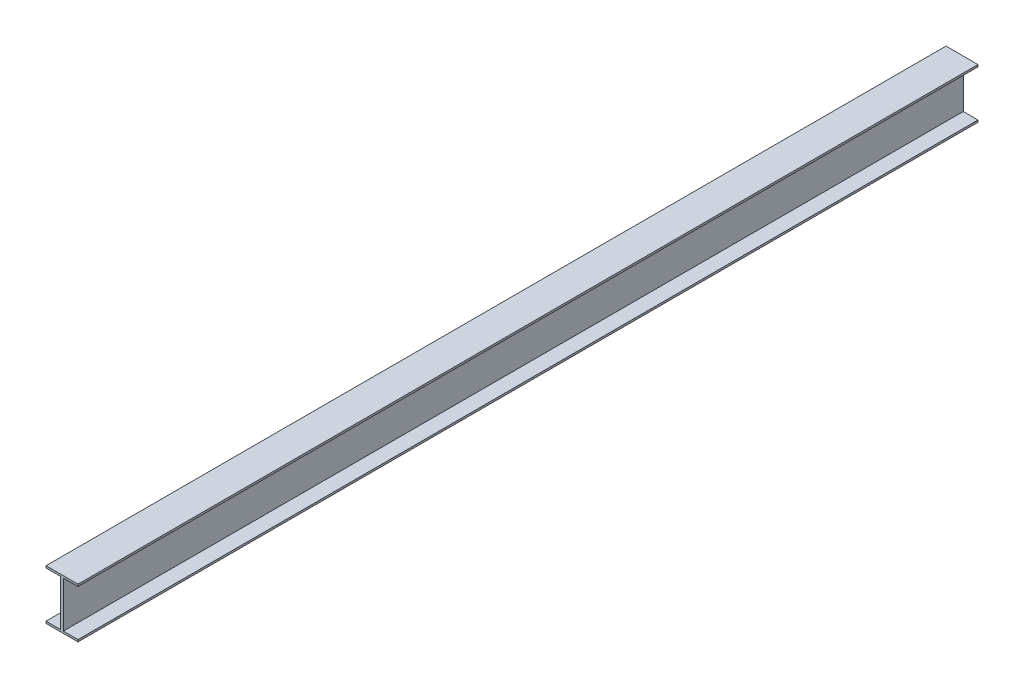
ISO-10303-21;
HEADER;
FILE_DESCRIPTION(('STEP AP214'),'2;1');
FILE_NAME('part.step','',(''),(''),'','','');
FILE_SCHEMA(('AUTOMOTIVE_DESIGN { 1 0 10303 214 1 1 1 1 }'));
ENDSEC;
DATA;
#1=APPLICATION_CONTEXT('core data for automotive mechanical design processes');
#2=APPLICATION_PROTOCOL_DEFINITION('international standard','automotive_design',2000,#1);
#3=PRODUCT_CONTEXT('',#1,'mechanical');
#4=PRODUCT('Part','Part','',(#3));
#5=PRODUCT_RELATED_PRODUCT_CATEGORY('part','',(#4));
#6=PRODUCT_DEFINITION_FORMATION('','',#4);
#7=PRODUCT_DEFINITION_CONTEXT('part definition',#1,'design');
#8=PRODUCT_DEFINITION('design','',#6,#7);
#9=PRODUCT_DEFINITION_SHAPE('','',#8);
#10=(LENGTH_UNIT() NAMED_UNIT(*) SI_UNIT(.MILLI.,.METRE.));
#11=(NAMED_UNIT(*) PLANE_ANGLE_UNIT() SI_UNIT($,.RADIAN.));
#12=(NAMED_UNIT(*) SI_UNIT($,.STERADIAN.) SOLID_ANGLE_UNIT());
#13=UNCERTAINTY_MEASURE_WITH_UNIT(LENGTH_MEASURE(1.E-05),#10,'distance_accuracy_value','');
#14=(GEOMETRIC_REPRESENTATION_CONTEXT(3) GLOBAL_UNCERTAINTY_ASSIGNED_CONTEXT((#13)) GLOBAL_UNIT_ASSIGNED_CONTEXT((#10,
#11,#12)) REPRESENTATION_CONTEXT('',''));
#15=CARTESIAN_POINT('',(0.,0.,0.));
#16=DIRECTION('',(0.,0.,1.));
#17=DIRECTION('',(1.,0.,0.));
#18=AXIS2_PLACEMENT_3D('',#15,#16,#17);
#19=CARTESIAN_POINT('',(0.,0.,4500.));
#20=DIRECTION('',(1.,0.,0.));
#21=DIRECTION('',(0.,0.,-1.));
#22=AXIS2_PLACEMENT_3D('',#19,#20,#21);
#23=PLANE('',#22);
#24=DIRECTION('',(0.,-1.,0.));
#25=VECTOR('',#24,1.);
#26=CARTESIAN_POINT('',(0.,0.,0.));
#27=LINE('',#26,#25);
#28=CARTESIAN_POINT('',(0.,250.,0.));
#29=VERTEX_POINT('',#28);
#30=CARTESIAN_POINT('',(0.,240.,0.));
#31=VERTEX_POINT('',#30);
#32=EDGE_CURVE('E145',#29,#31,#27,.T.);
#33=ORIENTED_EDGE('',*,*,#32,.T.);
#34=DIRECTION('',(0.,0.,1.));
#35=VECTOR('',#34,1.);
#36=CARTESIAN_POINT('',(0.,240.,0.));
#37=LINE('',#36,#35);
#38=CARTESIAN_POINT('',(0.,240.,4500.));
#39=VERTEX_POINT('',#38);
#40=EDGE_CURVE('E194',#31,#39,#37,.T.);
#41=ORIENTED_EDGE('',*,*,#40,.T.);
#42=DIRECTION('',(0.,-1.,0.));
#43=VECTOR('',#42,1.);
#44=CARTESIAN_POINT('',(0.,0.,4500.));
#45=LINE('',#44,#43);
#46=CARTESIAN_POINT('',(0.,250.,4500.));
#47=VERTEX_POINT('',#46);
#48=EDGE_CURVE('E201',#47,#39,#45,.T.);
#49=ORIENTED_EDGE('',*,*,#48,.F.);
#50=DIRECTION('',(0.,0.,-1.));
#51=VECTOR('',#50,1.);
#52=CARTESIAN_POINT('',(0.,250.,4500.));
#53=LINE('',#52,#51);
#54=EDGE_CURVE('E163',#47,#29,#53,.T.);
#55=ORIENTED_EDGE('',*,*,#54,.T.);
#56=EDGE_LOOP('',(#33,#41,#49,#55));
#57=FACE_BOUND('',#56,.T.);
#58=ADVANCED_FACE('F34',(#57),#23,.F.);
#59=CARTESIAN_POINT('',(160.,0.,4500.));
#60=DIRECTION('',(-1.,0.,0.));
#61=DIRECTION('',(0.,0.,1.));
#62=AXIS2_PLACEMENT_3D('',#59,#60,#61);
#63=PLANE('',#62);
#64=DIRECTION('',(0.,1.,0.));
#65=VECTOR('',#64,1.);
#66=CARTESIAN_POINT('',(160.,0.,0.));
#67=LINE('',#66,#65);
#68=CARTESIAN_POINT('',(160.,0.,0.));
#69=VERTEX_POINT('',#68);
#70=CARTESIAN_POINT('',(160.,10.,0.));
#71=VERTEX_POINT('',#70);
#72=EDGE_CURVE('E158',#69,#71,#67,.T.);
#73=ORIENTED_EDGE('',*,*,#72,.T.);
#74=DIRECTION('',(0.,0.,1.));
#75=VECTOR('',#74,1.);
#76=CARTESIAN_POINT('',(160.,10.,0.));
#77=LINE('',#76,#75);
#78=CARTESIAN_POINT('',(160.,10.,4500.));
#79=VERTEX_POINT('',#78);
#80=EDGE_CURVE('E146',#71,#79,#77,.T.);
#81=ORIENTED_EDGE('',*,*,#80,.T.);
#82=DIRECTION('',(0.,1.,0.));
#83=VECTOR('',#82,1.);
#84=CARTESIAN_POINT('',(160.,0.,4500.));
#85=LINE('',#84,#83);
#86=CARTESIAN_POINT('',(160.,0.,4500.));
#87=VERTEX_POINT('',#86);
#88=EDGE_CURVE('E174',#87,#79,#85,.T.);
#89=ORIENTED_EDGE('',*,*,#88,.F.);
#90=DIRECTION('',(0.,0.,-1.));
#91=VECTOR('',#90,1.);
#92=CARTESIAN_POINT('',(160.,0.,4500.));
#93=LINE('',#92,#91);
#94=EDGE_CURVE('E42',#87,#69,#93,.T.);
#95=ORIENTED_EDGE('',*,*,#94,.T.);
#96=EDGE_LOOP('',(#73,#81,#89,#95));
#97=FACE_BOUND('',#96,.T.);
#98=ADVANCED_FACE('F172',(#97),#63,.F.);
#99=CARTESIAN_POINT('',(0.,10.,4500.));
#100=VERTEX_POINT('',#99);
#101=CARTESIAN_POINT('',(0.,0.,4500.));
#102=VERTEX_POINT('',#101);
#103=EDGE_CURVE('E138',#100,#102,#45,.T.);
#104=ORIENTED_EDGE('',*,*,#103,.F.);
#105=DIRECTION('',(0.,0.,1.));
#106=VECTOR('',#105,1.);
#107=CARTESIAN_POINT('',(0.,10.,0.));
#108=LINE('',#107,#106);
#109=CARTESIAN_POINT('',(0.,10.,0.));
#110=VERTEX_POINT('',#109);
#111=EDGE_CURVE('E126',#110,#100,#108,.T.);
#112=ORIENTED_EDGE('',*,*,#111,.F.);
#113=CARTESIAN_POINT('',(0.,0.,0.));
#114=VERTEX_POINT('',#113);
#115=EDGE_CURVE('E136',#110,#114,#27,.T.);
#116=ORIENTED_EDGE('',*,*,#115,.T.);
#117=DIRECTION('',(0.,0.,-1.));
#118=VECTOR('',#117,1.);
#119=CARTESIAN_POINT('',(0.,0.,4500.));
#120=LINE('',#119,#118);
#121=EDGE_CURVE('E11',#102,#114,#120,.T.);
#122=ORIENTED_EDGE('',*,*,#121,.F.);
#123=EDGE_LOOP('',(#104,#112,#116,#122));
#124=FACE_BOUND('',#123,.T.);
#125=ADVANCED_FACE('F36',(#124),#23,.F.);
#126=CARTESIAN_POINT('',(0.,0.,4500.));
#127=DIRECTION('',(0.,1.,0.));
#128=DIRECTION('',(0.,0.,1.));
#129=AXIS2_PLACEMENT_3D('',#126,#127,#128);
#130=PLANE('',#129);
#131=DIRECTION('',(1.,0.,0.));
#132=VECTOR('',#131,1.);
#133=CARTESIAN_POINT('',(0.,0.,0.));
#134=LINE('',#133,#132);
#135=EDGE_CURVE('E144',#114,#69,#134,.T.);
#136=ORIENTED_EDGE('',*,*,#135,.T.);
#137=ORIENTED_EDGE('',*,*,#94,.F.);
#138=DIRECTION('',(1.,0.,0.));
#139=VECTOR('',#138,1.);
#140=CARTESIAN_POINT('',(0.,0.,4500.));
#141=LINE('',#140,#139);
#142=EDGE_CURVE('E204',#102,#87,#141,.T.);
#143=ORIENTED_EDGE('',*,*,#142,.F.);
#144=ORIENTED_EDGE('',*,*,#121,.T.);
#145=EDGE_LOOP('',(#136,#137,#143,#144));
#146=FACE_BOUND('',#145,.T.);
#147=ADVANCED_FACE('F258',(#146),#130,.F.);
#148=CARTESIAN_POINT('',(160.,240.,4500.));
#149=VERTEX_POINT('',#148);
#150=CARTESIAN_POINT('',(160.,250.,4500.));
#151=VERTEX_POINT('',#150);
#152=EDGE_CURVE('E205',#149,#151,#85,.T.);
#153=ORIENTED_EDGE('',*,*,#152,.F.);
#154=DIRECTION('',(0.,0.,1.));
#155=VECTOR('',#154,1.);
#156=CARTESIAN_POINT('',(160.,240.,0.));
#157=LINE('',#156,#155);
#158=CARTESIAN_POINT('',(160.,240.,0.));
#159=VERTEX_POINT('',#158);
#160=EDGE_CURVE('E182',#159,#149,#157,.T.);
#161=ORIENTED_EDGE('',*,*,#160,.F.);
#162=CARTESIAN_POINT('',(160.,250.,0.));
#163=VERTEX_POINT('',#162);
#164=EDGE_CURVE('E157',#159,#163,#67,.T.);
#165=ORIENTED_EDGE('',*,*,#164,.T.);
#166=DIRECTION('',(0.,0.,-1.));
#167=VECTOR('',#166,1.);
#168=CARTESIAN_POINT('',(160.,250.,4500.));
#169=LINE('',#168,#167);
#170=EDGE_CURVE('E166',#151,#163,#169,.T.);
#171=ORIENTED_EDGE('',*,*,#170,.F.);
#172=EDGE_LOOP('',(#153,#161,#165,#171));
#173=FACE_BOUND('',#172,.T.);
#174=ADVANCED_FACE('F217',(#173),#63,.F.);
#175=CARTESIAN_POINT('',(0.,250.,4500.));
#176=DIRECTION('',(0.,-1.,0.));
#177=DIRECTION('',(0.,0.,-1.));
#178=AXIS2_PLACEMENT_3D('',#175,#176,#177);
#179=PLANE('',#178);
#180=DIRECTION('',(-1.,0.,0.));
#181=VECTOR('',#180,1.);
#182=CARTESIAN_POINT('',(0.,250.,0.));
#183=LINE('',#182,#181);
#184=EDGE_CURVE('E161',#163,#29,#183,.T.);
#185=ORIENTED_EDGE('',*,*,#184,.T.);
#186=ORIENTED_EDGE('',*,*,#54,.F.);
#187=DIRECTION('',(-1.,0.,0.));
#188=VECTOR('',#187,1.);
#189=CARTESIAN_POINT('',(0.,250.,4500.));
#190=LINE('',#189,#188);
#191=EDGE_CURVE('E154',#151,#47,#190,.T.);
#192=ORIENTED_EDGE('',*,*,#191,.F.);
#193=ORIENTED_EDGE('',*,*,#170,.T.);
#194=EDGE_LOOP('',(#185,#186,#192,#193));
#195=FACE_BOUND('',#194,.T.);
#196=ADVANCED_FACE('F221',(#195),#179,.F.);
#197=CARTESIAN_POINT('',(0.,0.,4500.));
#198=DIRECTION('',(0.,0.,-1.));
#199=DIRECTION('',(-1.,0.,0.));
#200=AXIS2_PLACEMENT_3D('',#197,#198,#199);
#201=PLANE('',#200);
#202=ORIENTED_EDGE('',*,*,#48,.T.);
#203=DIRECTION('',(-1.,0.,0.));
#204=VECTOR('',#203,1.);
#205=CARTESIAN_POINT('',(0.,240.,4500.));
#206=LINE('',#205,#204);
#207=CARTESIAN_POINT('',(73.5,240.,4500.));
#208=VERTEX_POINT('',#207);
#209=EDGE_CURVE('E131',#208,#39,#206,.T.);
#210=ORIENTED_EDGE('',*,*,#209,.F.);
#211=DIRECTION('',(0.,1.,0.));
#212=VECTOR('',#211,1.);
#213=CARTESIAN_POINT('',(73.5,240.,4500.));
#214=LINE('',#213,#212);
#215=CARTESIAN_POINT('',(73.5,10.0000000000001,4500.));
#216=VERTEX_POINT('',#215);
#217=EDGE_CURVE('E229',#216,#208,#214,.T.);
#218=ORIENTED_EDGE('',*,*,#217,.F.);
#219=DIRECTION('',(1.,0.,0.));
#220=VECTOR('',#219,1.);
#221=CARTESIAN_POINT('',(0.,10.,4500.));
#222=LINE('',#221,#220);
#223=EDGE_CURVE('E232',#100,#216,#222,.T.);
#224=ORIENTED_EDGE('',*,*,#223,.F.);
#225=ORIENTED_EDGE('',*,*,#103,.T.);
#226=ORIENTED_EDGE('',*,*,#142,.T.);
#227=ORIENTED_EDGE('',*,*,#88,.T.);
#228=DIRECTION('',(1.,0.,0.));
#229=VECTOR('',#228,1.);
#230=CARTESIAN_POINT('',(160.,10.,4500.));
#231=LINE('',#230,#229);
#232=CARTESIAN_POINT('',(86.5,10.0000000000001,4500.));
#233=VERTEX_POINT('',#232);
#234=EDGE_CURVE('E197',#233,#79,#231,.T.);
#235=ORIENTED_EDGE('',*,*,#234,.F.);
#236=DIRECTION('',(0.,-1.,0.));
#237=VECTOR('',#236,1.);
#238=CARTESIAN_POINT('',(86.5,240.,4500.));
#239=LINE('',#238,#237);
#240=CARTESIAN_POINT('',(86.5,240.,4500.));
#241=VERTEX_POINT('',#240);
#242=EDGE_CURVE('E193',#241,#233,#239,.T.);
#243=ORIENTED_EDGE('',*,*,#242,.F.);
#244=DIRECTION('',(-1.,0.,0.));
#245=VECTOR('',#244,1.);
#246=CARTESIAN_POINT('',(160.,240.,4500.));
#247=LINE('',#246,#245);
#248=EDGE_CURVE('E190',#149,#241,#247,.T.);
#249=ORIENTED_EDGE('',*,*,#248,.F.);
#250=ORIENTED_EDGE('',*,*,#152,.T.);
#251=ORIENTED_EDGE('',*,*,#191,.T.);
#252=EDGE_LOOP('',(#202,#210,#218,#224,#225,#226,#227,#235,#243,#249,#250,#251));
#253=FACE_BOUND('',#252,.T.);
#254=ADVANCED_FACE('F211',(#253),#201,.F.);
#255=CARTESIAN_POINT('',(0.,0.,0.));
#256=DIRECTION('',(0.,0.,-1.));
#257=DIRECTION('',(-1.,0.,0.));
#258=AXIS2_PLACEMENT_3D('',#255,#256,#257);
#259=PLANE('',#258);
#260=DIRECTION('',(-1.,0.,0.));
#261=VECTOR('',#260,1.);
#262=CARTESIAN_POINT('',(0.,240.,0.));
#263=LINE('',#262,#261);
#264=CARTESIAN_POINT('',(73.5,240.,0.));
#265=VERTEX_POINT('',#264);
#266=EDGE_CURVE('E139',#265,#31,#263,.T.);
#267=ORIENTED_EDGE('',*,*,#266,.T.);
#268=ORIENTED_EDGE('',*,*,#32,.F.);
#269=ORIENTED_EDGE('',*,*,#184,.F.);
#270=ORIENTED_EDGE('',*,*,#164,.F.);
#271=DIRECTION('',(-1.,0.,0.));
#272=VECTOR('',#271,1.);
#273=CARTESIAN_POINT('',(160.,240.,0.));
#274=LINE('',#273,#272);
#275=CARTESIAN_POINT('',(86.5,240.,0.));
#276=VERTEX_POINT('',#275);
#277=EDGE_CURVE('E186',#159,#276,#274,.T.);
#278=ORIENTED_EDGE('',*,*,#277,.T.);
#279=DIRECTION('',(0.,-1.,0.));
#280=VECTOR('',#279,1.);
#281=CARTESIAN_POINT('',(86.5,240.,0.));
#282=LINE('',#281,#280);
#283=CARTESIAN_POINT('',(86.5,10.0000000000001,0.));
#284=VERTEX_POINT('',#283);
#285=EDGE_CURVE('E57',#276,#284,#282,.T.);
#286=ORIENTED_EDGE('',*,*,#285,.T.);
#287=DIRECTION('',(1.,0.,0.));
#288=VECTOR('',#287,1.);
#289=CARTESIAN_POINT('',(160.,10.,0.));
#290=LINE('',#289,#288);
#291=EDGE_CURVE('E179',#284,#71,#290,.T.);
#292=ORIENTED_EDGE('',*,*,#291,.T.);
#293=ORIENTED_EDGE('',*,*,#72,.F.);
#294=ORIENTED_EDGE('',*,*,#135,.F.);
#295=ORIENTED_EDGE('',*,*,#115,.F.);
#296=DIRECTION('',(1.,0.,0.));
#297=VECTOR('',#296,1.);
#298=CARTESIAN_POINT('',(0.,10.,0.));
#299=LINE('',#298,#297);
#300=CARTESIAN_POINT('',(73.5,10.0000000000001,0.));
#301=VERTEX_POINT('',#300);
#302=EDGE_CURVE('E122',#110,#301,#299,.T.);
#303=ORIENTED_EDGE('',*,*,#302,.T.);
#304=DIRECTION('',(0.,1.,0.));
#305=VECTOR('',#304,1.);
#306=CARTESIAN_POINT('',(73.5,240.,0.));
#307=LINE('',#306,#305);
#308=EDGE_CURVE('E49',#301,#265,#307,.T.);
#309=ORIENTED_EDGE('',*,*,#308,.T.);
#310=EDGE_LOOP('',(#267,#268,#269,#270,#278,#286,#292,#293,#294,#295,#303,#309));
#311=FACE_BOUND('',#310,.T.);
#312=ADVANCED_FACE('F142',(#311),#259,.T.);
#313=CARTESIAN_POINT('',(160.,10.,0.));
#314=DIRECTION('',(0.,-1.,0.));
#315=DIRECTION('',(1.,0.,0.));
#316=AXIS2_PLACEMENT_3D('',#313,#314,#315);
#317=PLANE('',#316);
#318=ORIENTED_EDGE('',*,*,#234,.T.);
#319=ORIENTED_EDGE('',*,*,#80,.F.);
#320=ORIENTED_EDGE('',*,*,#291,.F.);
#321=DIRECTION('',(0.,0.,1.));
#322=VECTOR('',#321,1.);
#323=CARTESIAN_POINT('',(86.5,10.0000000000001,0.));
#324=LINE('',#323,#322);
#325=EDGE_CURVE('E150',#284,#233,#324,.T.);
#326=ORIENTED_EDGE('',*,*,#325,.T.);
#327=EDGE_LOOP('',(#318,#319,#320,#326));
#328=FACE_BOUND('',#327,.T.);
#329=ADVANCED_FACE('F242',(#328),#317,.F.);
#330=CARTESIAN_POINT('',(86.5,240.,0.));
#331=DIRECTION('',(-1.,0.,0.));
#332=DIRECTION('',(0.,0.,1.));
#333=AXIS2_PLACEMENT_3D('',#330,#331,#332);
#334=PLANE('',#333);
#335=ORIENTED_EDGE('',*,*,#242,.T.);
#336=ORIENTED_EDGE('',*,*,#325,.F.);
#337=ORIENTED_EDGE('',*,*,#285,.F.);
#338=DIRECTION('',(0.,0.,1.));
#339=VECTOR('',#338,1.);
#340=CARTESIAN_POINT('',(86.5,240.,0.));
#341=LINE('',#340,#339);
#342=EDGE_CURVE('E184',#276,#241,#341,.T.);
#343=ORIENTED_EDGE('',*,*,#342,.T.);
#344=EDGE_LOOP('',(#335,#336,#337,#343));
#345=FACE_BOUND('',#344,.T.);
#346=ADVANCED_FACE('F241',(#345),#334,.F.);
#347=CARTESIAN_POINT('',(160.,240.,0.));
#348=DIRECTION('',(0.,1.,0.));
#349=DIRECTION('',(-1.,0.,0.));
#350=AXIS2_PLACEMENT_3D('',#347,#348,#349);
#351=PLANE('',#350);
#352=ORIENTED_EDGE('',*,*,#248,.T.);
#353=ORIENTED_EDGE('',*,*,#342,.F.);
#354=ORIENTED_EDGE('',*,*,#277,.F.);
#355=ORIENTED_EDGE('',*,*,#160,.T.);
#356=EDGE_LOOP('',(#352,#353,#354,#355));
#357=FACE_BOUND('',#356,.T.);
#358=ADVANCED_FACE('F240',(#357),#351,.F.);
#359=CARTESIAN_POINT('',(0.,240.,0.));
#360=DIRECTION('',(0.,1.,0.));
#361=DIRECTION('',(-1.,0.,0.));
#362=AXIS2_PLACEMENT_3D('',#359,#360,#361);
#363=PLANE('',#362);
#364=ORIENTED_EDGE('',*,*,#209,.T.);
#365=ORIENTED_EDGE('',*,*,#40,.F.);
#366=ORIENTED_EDGE('',*,*,#266,.F.);
#367=DIRECTION('',(0.,0.,1.));
#368=VECTOR('',#367,1.);
#369=CARTESIAN_POINT('',(73.5,240.,0.));
#370=LINE('',#369,#368);
#371=EDGE_CURVE('E237',#265,#208,#370,.T.);
#372=ORIENTED_EDGE('',*,*,#371,.T.);
#373=EDGE_LOOP('',(#364,#365,#366,#372));
#374=FACE_BOUND('',#373,.T.);
#375=ADVANCED_FACE('F271',(#374),#363,.F.);
#376=CARTESIAN_POINT('',(73.5,240.,0.));
#377=DIRECTION('',(1.,0.,0.));
#378=DIRECTION('',(0.,0.,-1.));
#379=AXIS2_PLACEMENT_3D('',#376,#377,#378);
#380=PLANE('',#379);
#381=ORIENTED_EDGE('',*,*,#217,.T.);
#382=ORIENTED_EDGE('',*,*,#371,.F.);
#383=ORIENTED_EDGE('',*,*,#308,.F.);
#384=DIRECTION('',(0.,0.,1.));
#385=VECTOR('',#384,1.);
#386=CARTESIAN_POINT('',(73.5,10.0000000000001,0.));
#387=LINE('',#386,#385);
#388=EDGE_CURVE('E128',#301,#216,#387,.T.);
#389=ORIENTED_EDGE('',*,*,#388,.T.);
#390=EDGE_LOOP('',(#381,#382,#383,#389));
#391=FACE_BOUND('',#390,.T.);
#392=ADVANCED_FACE('F275',(#391),#380,.F.);
#393=CARTESIAN_POINT('',(0.,10.,0.));
#394=DIRECTION('',(0.,-1.,0.));
#395=DIRECTION('',(1.,0.,0.));
#396=AXIS2_PLACEMENT_3D('',#393,#394,#395);
#397=PLANE('',#396);
#398=ORIENTED_EDGE('',*,*,#223,.T.);
#399=ORIENTED_EDGE('',*,*,#388,.F.);
#400=ORIENTED_EDGE('',*,*,#302,.F.);
#401=ORIENTED_EDGE('',*,*,#111,.T.);
#402=EDGE_LOOP('',(#398,#399,#400,#401));
#403=FACE_BOUND('',#402,.T.);
#404=ADVANCED_FACE('F125',(#403),#397,.F.);
#405=CLOSED_SHELL('',(#58,#98,#125,#147,#174,#196,#254,#312,#329,#346,#358,#375,#392,#404));
#406=MANIFOLD_SOLID_BREP('B2',#405);
#407=ADVANCED_BREP_SHAPE_REPRESENTATION('',(#18,#406),#14);
#408=SHAPE_DEFINITION_REPRESENTATION(#9,#407);
ENDSEC;
END-ISO-10303-21;
